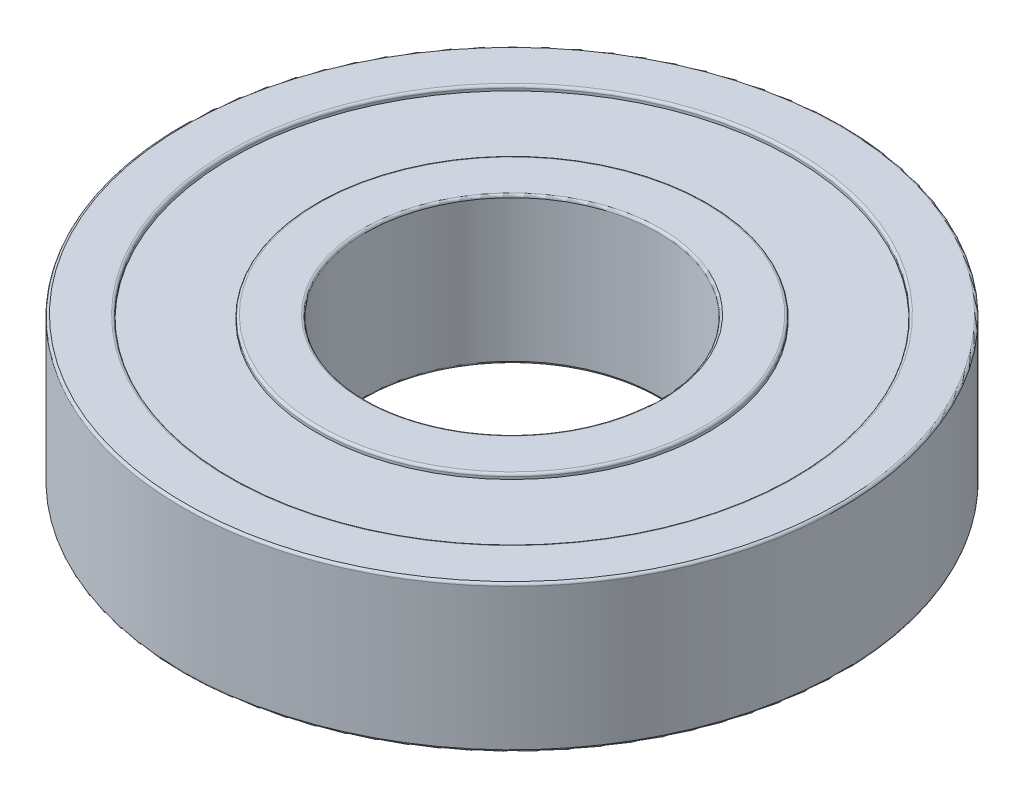
ISO-10303-21;
HEADER;
FILE_DESCRIPTION(('STEP AP214'),'2;1');
FILE_NAME('part.step','',(''),(''),'','','');
FILE_SCHEMA(('AUTOMOTIVE_DESIGN { 1 0 10303 214 1 1 1 1 }'));
ENDSEC;
DATA;
#1=APPLICATION_CONTEXT('core data for automotive mechanical design processes');
#2=APPLICATION_PROTOCOL_DEFINITION('international standard','automotive_design',2000,#1);
#3=PRODUCT_CONTEXT('',#1,'mechanical');
#4=PRODUCT('Part','Part','',(#3));
#5=PRODUCT_RELATED_PRODUCT_CATEGORY('part','',(#4));
#6=PRODUCT_DEFINITION_FORMATION('','',#4);
#7=PRODUCT_DEFINITION_CONTEXT('part definition',#1,'design');
#8=PRODUCT_DEFINITION('design','',#6,#7);
#9=PRODUCT_DEFINITION_SHAPE('','',#8);
#10=(LENGTH_UNIT() NAMED_UNIT(*) SI_UNIT(.MILLI.,.METRE.));
#11=(NAMED_UNIT(*) PLANE_ANGLE_UNIT() SI_UNIT($,.RADIAN.));
#12=(NAMED_UNIT(*) SI_UNIT($,.STERADIAN.) SOLID_ANGLE_UNIT());
#13=UNCERTAINTY_MEASURE_WITH_UNIT(LENGTH_MEASURE(1.E-05),#10,'distance_accuracy_value','');
#14=(GEOMETRIC_REPRESENTATION_CONTEXT(3) GLOBAL_UNCERTAINTY_ASSIGNED_CONTEXT((#13)) GLOBAL_UNIT_ASSIGNED_CONTEXT((#10,
#11,#12)) REPRESENTATION_CONTEXT('',''));
#15=CARTESIAN_POINT('',(0.,0.,0.));
#16=DIRECTION('',(0.,0.,1.));
#17=DIRECTION('',(1.,0.,0.));
#18=AXIS2_PLACEMENT_3D('',#15,#16,#17);
#19=CARTESIAN_POINT('',(0.,0.,0.));
#20=DIRECTION('',(0.,-1.,0.));
#21=DIRECTION('',(0.,0.,-1.));
#22=AXIS2_PLACEMENT_3D('',#19,#20,#21);
#23=CYLINDRICAL_SURFACE('',#22,5.75);
#24=CARTESIAN_POINT('',(0.,-1.45,0.));
#25=DIRECTION('',(0.,1.,0.));
#26=DIRECTION('',(0.,0.,1.));
#27=AXIS2_PLACEMENT_3D('',#24,#25,#26);
#28=CIRCLE('',#27,5.75);
#29=CARTESIAN_POINT('',(0.,-1.45,5.75));
#30=VERTEX_POINT('',#29);
#31=EDGE_CURVE('E75',#30,#30,#28,.F.);
#32=ORIENTED_EDGE('',*,*,#31,.T.);
#33=EDGE_LOOP('',(#32));
#34=FACE_BOUND('',#33,.T.);
#35=CARTESIAN_POINT('',(0.,-1.4,0.));
#36=DIRECTION('',(0.,1.,0.));
#37=DIRECTION('',(0.,0.,1.));
#38=AXIS2_PLACEMENT_3D('',#35,#36,#37);
#39=CIRCLE('',#38,5.75);
#40=CARTESIAN_POINT('',(0.,-1.4,5.75));
#41=VERTEX_POINT('',#40);
#42=EDGE_CURVE('E90',#41,#41,#39,.F.);
#43=ORIENTED_EDGE('',*,*,#42,.F.);
#44=EDGE_LOOP('',(#43));
#45=FACE_BOUND('',#44,.T.);
#46=ADVANCED_FACE('F33',(#34,#45),#23,.F.);
#47=CARTESIAN_POINT('',(0.,0.,0.));
#48=DIRECTION('',(0.,-1.,0.));
#49=DIRECTION('',(0.,0.,-1.));
#50=AXIS2_PLACEMENT_3D('',#47,#48,#49);
#51=CYLINDRICAL_SURFACE('',#50,4.);
#52=CARTESIAN_POINT('',(0.,-1.45,0.));
#53=DIRECTION('',(0.,1.,0.));
#54=DIRECTION('',(0.,0.,1.));
#55=AXIS2_PLACEMENT_3D('',#52,#53,#54);
#56=CIRCLE('',#55,4.);
#57=CARTESIAN_POINT('',(0.,-1.45,4.));
#58=VERTEX_POINT('',#57);
#59=EDGE_CURVE('E57',#58,#58,#56,.T.);
#60=ORIENTED_EDGE('',*,*,#59,.T.);
#61=EDGE_LOOP('',(#60));
#62=FACE_BOUND('',#61,.T.);
#63=CARTESIAN_POINT('',(0.,-1.4,0.));
#64=DIRECTION('',(0.,1.,0.));
#65=DIRECTION('',(0.,0.,1.));
#66=AXIS2_PLACEMENT_3D('',#63,#64,#65);
#67=CIRCLE('',#66,4.);
#68=CARTESIAN_POINT('',(0.,-1.4,4.));
#69=VERTEX_POINT('',#68);
#70=EDGE_CURVE('E96',#69,#69,#67,.T.);
#71=ORIENTED_EDGE('',*,*,#70,.F.);
#72=EDGE_LOOP('',(#71));
#73=FACE_BOUND('',#72,.T.);
#74=ADVANCED_FACE('F169',(#62,#73),#51,.T.);
#75=CARTESIAN_POINT('',(0.,0.,0.));
#76=DIRECTION('',(0.,-1.,0.));
#77=DIRECTION('',(0.,0.,-1.));
#78=AXIS2_PLACEMENT_3D('',#75,#76,#77);
#79=CYLINDRICAL_SURFACE('',#78,5.75);
#80=CARTESIAN_POINT('',(0.,1.45,0.));
#81=DIRECTION('',(0.,-1.,0.));
#82=DIRECTION('',(0.,0.,-1.));
#83=AXIS2_PLACEMENT_3D('',#80,#81,#82);
#84=CIRCLE('',#83,5.75);
#85=CARTESIAN_POINT('',(0.,1.45,-5.75));
#86=VERTEX_POINT('',#85);
#87=EDGE_CURVE('E66',#86,#86,#84,.F.);
#88=ORIENTED_EDGE('',*,*,#87,.T.);
#89=EDGE_LOOP('',(#88));
#90=FACE_BOUND('',#89,.T.);
#91=CARTESIAN_POINT('',(0.,1.4,0.));
#92=DIRECTION('',(0.,-1.,0.));
#93=DIRECTION('',(0.,0.,-1.));
#94=AXIS2_PLACEMENT_3D('',#91,#92,#93);
#95=CIRCLE('',#94,5.75);
#96=CARTESIAN_POINT('',(0.,1.4,-5.75));
#97=VERTEX_POINT('',#96);
#98=EDGE_CURVE('E109',#97,#97,#95,.F.);
#99=ORIENTED_EDGE('',*,*,#98,.F.);
#100=EDGE_LOOP('',(#99));
#101=FACE_BOUND('',#100,.T.);
#102=ADVANCED_FACE('F157',(#90,#101),#79,.F.);
#103=CARTESIAN_POINT('',(0.,0.,0.));
#104=DIRECTION('',(0.,-1.,0.));
#105=DIRECTION('',(0.,0.,-1.));
#106=AXIS2_PLACEMENT_3D('',#103,#104,#105);
#107=CYLINDRICAL_SURFACE('',#106,6.75);
#108=CARTESIAN_POINT('',(0.,-1.45,0.));
#109=DIRECTION('',(0.,1.,0.));
#110=DIRECTION('',(0.,0.,1.));
#111=AXIS2_PLACEMENT_3D('',#108,#109,#110);
#112=CIRCLE('',#111,6.75);
#113=CARTESIAN_POINT('',(0.,-1.45,6.75));
#114=VERTEX_POINT('',#113);
#115=EDGE_CURVE('E78',#114,#114,#112,.T.);
#116=ORIENTED_EDGE('',*,*,#115,.T.);
#117=EDGE_LOOP('',(#116));
#118=FACE_BOUND('',#117,.T.);
#119=CARTESIAN_POINT('',(0.,1.45,0.));
#120=DIRECTION('',(0.,-1.,0.));
#121=DIRECTION('',(0.,0.,-1.));
#122=AXIS2_PLACEMENT_3D('',#119,#120,#121);
#123=CIRCLE('',#122,6.75);
#124=CARTESIAN_POINT('',(0.,1.45,-6.75));
#125=VERTEX_POINT('',#124);
#126=EDGE_CURVE('E81',#125,#125,#123,.T.);
#127=ORIENTED_EDGE('',*,*,#126,.T.);
#128=EDGE_LOOP('',(#127));
#129=FACE_BOUND('',#128,.T.);
#130=ADVANCED_FACE('F168',(#118,#129),#107,.T.);
#131=CARTESIAN_POINT('',(-6.75,1.5,0.));
#132=DIRECTION('',(0.,-1.,0.));
#133=DIRECTION('',(0.,0.,-1.));
#134=AXIS2_PLACEMENT_3D('',#131,#132,#133);
#135=PLANE('',#134);
#136=CARTESIAN_POINT('',(0.,1.5,0.));
#137=DIRECTION('',(0.,-1.,0.));
#138=DIRECTION('',(0.,0.,-1.));
#139=AXIS2_PLACEMENT_3D('',#136,#137,#138);
#140=CIRCLE('',#139,5.8);
#141=CARTESIAN_POINT('',(0.,1.5,-5.8));
#142=VERTEX_POINT('',#141);
#143=EDGE_CURVE('E69',#142,#142,#140,.T.);
#144=ORIENTED_EDGE('',*,*,#143,.T.);
#145=EDGE_LOOP('',(#144));
#146=FACE_BOUND('',#145,.T.);
#147=CARTESIAN_POINT('',(0.,1.5,0.));
#148=DIRECTION('',(0.,-1.,0.));
#149=DIRECTION('',(0.,0.,-1.));
#150=AXIS2_PLACEMENT_3D('',#147,#148,#149);
#151=CIRCLE('',#150,6.7);
#152=CARTESIAN_POINT('',(0.,1.5,-6.7));
#153=VERTEX_POINT('',#152);
#154=EDGE_CURVE('E72',#153,#153,#151,.F.);
#155=ORIENTED_EDGE('',*,*,#154,.T.);
#156=EDGE_LOOP('',(#155));
#157=FACE_BOUND('',#156,.T.);
#158=ADVANCED_FACE('F175',(#146,#157),#135,.F.);
#159=CARTESIAN_POINT('',(-6.75,-1.5,0.));
#160=DIRECTION('',(0.,1.,0.));
#161=DIRECTION('',(0.,0.,1.));
#162=AXIS2_PLACEMENT_3D('',#159,#160,#161);
#163=PLANE('',#162);
#164=CARTESIAN_POINT('',(0.,-1.5,0.));
#165=DIRECTION('',(0.,1.,0.));
#166=DIRECTION('',(0.,0.,1.));
#167=AXIS2_PLACEMENT_3D('',#164,#165,#166);
#168=CIRCLE('',#167,6.7);
#169=CARTESIAN_POINT('',(0.,-1.5,6.7));
#170=VERTEX_POINT('',#169);
#171=EDGE_CURVE('E84',#170,#170,#168,.F.);
#172=ORIENTED_EDGE('',*,*,#171,.T.);
#173=EDGE_LOOP('',(#172));
#174=FACE_BOUND('',#173,.T.);
#175=CARTESIAN_POINT('',(0.,-1.5,0.));
#176=DIRECTION('',(0.,1.,0.));
#177=DIRECTION('',(0.,0.,1.));
#178=AXIS2_PLACEMENT_3D('',#175,#176,#177);
#179=CIRCLE('',#178,5.8);
#180=CARTESIAN_POINT('',(0.,-1.5,5.8));
#181=VERTEX_POINT('',#180);
#182=EDGE_CURVE('E87',#181,#181,#179,.T.);
#183=ORIENTED_EDGE('',*,*,#182,.T.);
#184=EDGE_LOOP('',(#183));
#185=FACE_BOUND('',#184,.T.);
#186=ADVANCED_FACE('F244',(#174,#185),#163,.F.);
#187=CARTESIAN_POINT('',(-5.75,1.4,0.));
#188=DIRECTION('',(0.,-1.,0.));
#189=DIRECTION('',(0.,0.,-1.));
#190=AXIS2_PLACEMENT_3D('',#187,#188,#189);
#191=PLANE('',#190);
#192=CARTESIAN_POINT('',(0.,1.4,0.));
#193=DIRECTION('',(0.,-1.,0.));
#194=DIRECTION('',(0.,0.,-1.));
#195=AXIS2_PLACEMENT_3D('',#192,#193,#194);
#196=CIRCLE('',#195,4.);
#197=CARTESIAN_POINT('',(0.,1.4,-4.));
#198=VERTEX_POINT('',#197);
#199=EDGE_CURVE('E103',#198,#198,#196,.F.);
#200=ORIENTED_EDGE('',*,*,#199,.F.);
#201=EDGE_LOOP('',(#200));
#202=FACE_BOUND('',#201,.T.);
#203=ORIENTED_EDGE('',*,*,#98,.T.);
#204=EDGE_LOOP('',(#203));
#205=FACE_BOUND('',#204,.T.);
#206=ADVANCED_FACE('F253',(#202,#205),#191,.F.);
#207=CARTESIAN_POINT('',(-3.,1.5,0.));
#208=DIRECTION('',(0.,-1.,0.));
#209=DIRECTION('',(0.,0.,-1.));
#210=AXIS2_PLACEMENT_3D('',#207,#208,#209);
#211=PLANE('',#210);
#212=CARTESIAN_POINT('',(0.,1.5,0.));
#213=DIRECTION('',(0.,-1.,0.));
#214=DIRECTION('',(0.,0.,-1.));
#215=AXIS2_PLACEMENT_3D('',#212,#213,#214);
#216=CIRCLE('',#215,3.05);
#217=CARTESIAN_POINT('',(0.,1.5,-3.05));
#218=VERTEX_POINT('',#217);
#219=EDGE_CURVE('E41',#218,#218,#216,.T.);
#220=ORIENTED_EDGE('',*,*,#219,.T.);
#221=EDGE_LOOP('',(#220));
#222=FACE_BOUND('',#221,.T.);
#223=CARTESIAN_POINT('',(0.,1.5,0.));
#224=DIRECTION('',(0.,-1.,0.));
#225=DIRECTION('',(0.,0.,-1.));
#226=AXIS2_PLACEMENT_3D('',#223,#224,#225);
#227=CIRCLE('',#226,3.95);
#228=CARTESIAN_POINT('',(0.,1.5,-3.95));
#229=VERTEX_POINT('',#228);
#230=EDGE_CURVE('E45',#229,#229,#227,.F.);
#231=ORIENTED_EDGE('',*,*,#230,.T.);
#232=EDGE_LOOP('',(#231));
#233=FACE_BOUND('',#232,.T.);
#234=ADVANCED_FACE('F309',(#222,#233),#211,.F.);
#235=CARTESIAN_POINT('',(0.,0.,0.));
#236=DIRECTION('',(0.,-1.,0.));
#237=DIRECTION('',(0.,0.,-1.));
#238=AXIS2_PLACEMENT_3D('',#235,#236,#237);
#239=CYLINDRICAL_SURFACE('',#238,4.);
#240=CARTESIAN_POINT('',(0.,1.45,0.));
#241=DIRECTION('',(0.,-1.,0.));
#242=DIRECTION('',(0.,0.,-1.));
#243=AXIS2_PLACEMENT_3D('',#240,#241,#242);
#244=CIRCLE('',#243,4.);
#245=CARTESIAN_POINT('',(0.,1.45,-4.));
#246=VERTEX_POINT('',#245);
#247=EDGE_CURVE('E10',#246,#246,#244,.T.);
#248=ORIENTED_EDGE('',*,*,#247,.T.);
#249=EDGE_LOOP('',(#248));
#250=FACE_BOUND('',#249,.T.);
#251=ORIENTED_EDGE('',*,*,#199,.T.);
#252=EDGE_LOOP('',(#251));
#253=FACE_BOUND('',#252,.T.);
#254=ADVANCED_FACE('F142',(#250,#253),#239,.T.);
#255=CARTESIAN_POINT('',(0.,0.,0.));
#256=DIRECTION('',(0.,-1.,0.));
#257=DIRECTION('',(0.,0.,-1.));
#258=AXIS2_PLACEMENT_3D('',#255,#256,#257);
#259=CYLINDRICAL_SURFACE('',#258,3.);
#260=CARTESIAN_POINT('',(0.,-1.45,0.));
#261=DIRECTION('',(0.,1.,0.));
#262=DIRECTION('',(0.,0.,1.));
#263=AXIS2_PLACEMENT_3D('',#260,#261,#262);
#264=CIRCLE('',#263,3.);
#265=CARTESIAN_POINT('',(0.,-1.45,3.));
#266=VERTEX_POINT('',#265);
#267=EDGE_CURVE('E49',#266,#266,#264,.F.);
#268=ORIENTED_EDGE('',*,*,#267,.T.);
#269=EDGE_LOOP('',(#268));
#270=FACE_BOUND('',#269,.T.);
#271=CARTESIAN_POINT('',(0.,1.45,0.));
#272=DIRECTION('',(0.,-1.,0.));
#273=DIRECTION('',(0.,0.,-1.));
#274=AXIS2_PLACEMENT_3D('',#271,#272,#273);
#275=CIRCLE('',#274,3.);
#276=CARTESIAN_POINT('',(0.,1.45,-3.));
#277=VERTEX_POINT('',#276);
#278=EDGE_CURVE('E54',#277,#277,#275,.F.);
#279=ORIENTED_EDGE('',*,*,#278,.T.);
#280=EDGE_LOOP('',(#279));
#281=FACE_BOUND('',#280,.T.);
#282=ADVANCED_FACE('F323',(#270,#281),#259,.F.);
#283=CARTESIAN_POINT('',(-3.,-1.5,0.));
#284=DIRECTION('',(0.,1.,0.));
#285=DIRECTION('',(0.,0.,1.));
#286=AXIS2_PLACEMENT_3D('',#283,#284,#285);
#287=PLANE('',#286);
#288=CARTESIAN_POINT('',(0.,-1.5,0.));
#289=DIRECTION('',(0.,1.,0.));
#290=DIRECTION('',(0.,0.,1.));
#291=AXIS2_PLACEMENT_3D('',#288,#289,#290);
#292=CIRCLE('',#291,3.95);
#293=CARTESIAN_POINT('',(0.,-1.5,3.95));
#294=VERTEX_POINT('',#293);
#295=EDGE_CURVE('E60',#294,#294,#292,.F.);
#296=ORIENTED_EDGE('',*,*,#295,.T.);
#297=EDGE_LOOP('',(#296));
#298=FACE_BOUND('',#297,.T.);
#299=CARTESIAN_POINT('',(0.,-1.5,0.));
#300=DIRECTION('',(0.,1.,0.));
#301=DIRECTION('',(0.,0.,1.));
#302=AXIS2_PLACEMENT_3D('',#299,#300,#301);
#303=CIRCLE('',#302,3.05);
#304=CARTESIAN_POINT('',(0.,-1.5,3.05));
#305=VERTEX_POINT('',#304);
#306=EDGE_CURVE('E63',#305,#305,#303,.T.);
#307=ORIENTED_EDGE('',*,*,#306,.T.);
#308=EDGE_LOOP('',(#307));
#309=FACE_BOUND('',#308,.T.);
#310=ADVANCED_FACE('F331',(#298,#309),#287,.F.);
#311=CARTESIAN_POINT('',(-5.75,-1.4,0.));
#312=DIRECTION('',(0.,1.,0.));
#313=DIRECTION('',(0.,0.,1.));
#314=AXIS2_PLACEMENT_3D('',#311,#312,#313);
#315=PLANE('',#314);
#316=ORIENTED_EDGE('',*,*,#70,.T.);
#317=EDGE_LOOP('',(#316));
#318=FACE_BOUND('',#317,.T.);
#319=ORIENTED_EDGE('',*,*,#42,.T.);
#320=EDGE_LOOP('',(#319));
#321=FACE_BOUND('',#320,.T.);
#322=ADVANCED_FACE('F265',(#318,#321),#315,.F.);
#323=CARTESIAN_POINT('',(0.,-1.45,0.));
#324=DIRECTION('',(0.,1.,0.));
#325=DIRECTION('',(0.,0.,1.));
#326=AXIS2_PLACEMENT_3D('',#323,#324,#325);
#327=TOROIDAL_SURFACE('',#326,6.7,0.05);
#328=ORIENTED_EDGE('',*,*,#115,.F.);
#329=EDGE_LOOP('',(#328));
#330=FACE_BOUND('',#329,.T.);
#331=ORIENTED_EDGE('',*,*,#171,.F.);
#332=EDGE_LOOP('',(#331));
#333=FACE_BOUND('',#332,.T.);
#334=ADVANCED_FACE('F259',(#330,#333),#327,.T.);
#335=CARTESIAN_POINT('',(0.,-1.45,0.));
#336=DIRECTION('',(0.,1.,0.));
#337=DIRECTION('',(0.,0.,1.));
#338=AXIS2_PLACEMENT_3D('',#335,#336,#337);
#339=TOROIDAL_SURFACE('',#338,5.8,0.05);
#340=ORIENTED_EDGE('',*,*,#182,.F.);
#341=EDGE_LOOP('',(#340));
#342=FACE_BOUND('',#341,.T.);
#343=ORIENTED_EDGE('',*,*,#31,.F.);
#344=EDGE_LOOP('',(#343));
#345=FACE_BOUND('',#344,.T.);
#346=ADVANCED_FACE('F264',(#342,#345),#339,.T.);
#347=CARTESIAN_POINT('',(0.,1.45,0.));
#348=DIRECTION('',(0.,-1.,0.));
#349=DIRECTION('',(0.,0.,-1.));
#350=AXIS2_PLACEMENT_3D('',#347,#348,#349);
#351=TOROIDAL_SURFACE('',#350,5.8,0.05);
#352=ORIENTED_EDGE('',*,*,#87,.F.);
#353=EDGE_LOOP('',(#352));
#354=FACE_BOUND('',#353,.T.);
#355=ORIENTED_EDGE('',*,*,#143,.F.);
#356=EDGE_LOOP('',(#355));
#357=FACE_BOUND('',#356,.T.);
#358=ADVANCED_FACE('F276',(#354,#357),#351,.T.);
#359=CARTESIAN_POINT('',(0.,1.45,0.));
#360=DIRECTION('',(0.,-1.,0.));
#361=DIRECTION('',(0.,0.,-1.));
#362=AXIS2_PLACEMENT_3D('',#359,#360,#361);
#363=TOROIDAL_SURFACE('',#362,6.7,0.05);
#364=ORIENTED_EDGE('',*,*,#154,.F.);
#365=EDGE_LOOP('',(#364));
#366=FACE_BOUND('',#365,.T.);
#367=ORIENTED_EDGE('',*,*,#126,.F.);
#368=EDGE_LOOP('',(#367));
#369=FACE_BOUND('',#368,.T.);
#370=ADVANCED_FACE('F286',(#366,#369),#363,.T.);
#371=CARTESIAN_POINT('',(0.,-1.45,0.));
#372=DIRECTION('',(0.,1.,0.));
#373=DIRECTION('',(0.,0.,1.));
#374=AXIS2_PLACEMENT_3D('',#371,#372,#373);
#375=TOROIDAL_SURFACE('',#374,3.95,0.05);
#376=ORIENTED_EDGE('',*,*,#59,.F.);
#377=EDGE_LOOP('',(#376));
#378=FACE_BOUND('',#377,.T.);
#379=ORIENTED_EDGE('',*,*,#295,.F.);
#380=EDGE_LOOP('',(#379));
#381=FACE_BOUND('',#380,.T.);
#382=ADVANCED_FACE('F296',(#378,#381),#375,.T.);
#383=CARTESIAN_POINT('',(0.,-1.45,0.));
#384=DIRECTION('',(0.,1.,0.));
#385=DIRECTION('',(0.,0.,1.));
#386=AXIS2_PLACEMENT_3D('',#383,#384,#385);
#387=TOROIDAL_SURFACE('',#386,3.05,0.05);
#388=ORIENTED_EDGE('',*,*,#306,.F.);
#389=EDGE_LOOP('',(#388));
#390=FACE_BOUND('',#389,.T.);
#391=ORIENTED_EDGE('',*,*,#267,.F.);
#392=EDGE_LOOP('',(#391));
#393=FACE_BOUND('',#392,.T.);
#394=ADVANCED_FACE('F348',(#390,#393),#387,.T.);
#395=CARTESIAN_POINT('',(0.,1.45,0.));
#396=DIRECTION('',(0.,-1.,0.));
#397=DIRECTION('',(0.,0.,-1.));
#398=AXIS2_PLACEMENT_3D('',#395,#396,#397);
#399=TOROIDAL_SURFACE('',#398,3.05,0.05);
#400=ORIENTED_EDGE('',*,*,#278,.F.);
#401=EDGE_LOOP('',(#400));
#402=FACE_BOUND('',#401,.T.);
#403=ORIENTED_EDGE('',*,*,#219,.F.);
#404=EDGE_LOOP('',(#403));
#405=FACE_BOUND('',#404,.T.);
#406=ADVANCED_FACE('F358',(#402,#405),#399,.T.);
#407=CARTESIAN_POINT('',(0.,1.45,0.));
#408=DIRECTION('',(0.,-1.,0.));
#409=DIRECTION('',(0.,0.,-1.));
#410=AXIS2_PLACEMENT_3D('',#407,#408,#409);
#411=TOROIDAL_SURFACE('',#410,3.95,0.05);
#412=ORIENTED_EDGE('',*,*,#230,.F.);
#413=EDGE_LOOP('',(#412));
#414=FACE_BOUND('',#413,.T.);
#415=ORIENTED_EDGE('',*,*,#247,.F.);
#416=EDGE_LOOP('',(#415));
#417=FACE_BOUND('',#416,.T.);
#418=ADVANCED_FACE('F35',(#414,#417),#411,.T.);
#419=CLOSED_SHELL('',(#46,#74,#102,#130,#158,#186,#206,#234,#254,#282,#310,#322,#334,#346,#358,
#370,#382,#394,#406,#418));
#420=CARTESIAN_POINT('',(-3.,-1.3,0.));
#421=DIRECTION('',(0.,-1.,0.));
#422=DIRECTION('',(0.,0.,-1.));
#423=AXIS2_PLACEMENT_3D('',#420,#421,#422);
#424=PLANE('',#423);
#425=CARTESIAN_POINT('',(0.,-1.3,0.));
#426=DIRECTION('',(0.,-1.,0.));
#427=DIRECTION('',(0.,0.,-1.));
#428=AXIS2_PLACEMENT_3D('',#425,#426,#427);
#429=CIRCLE('',#428,4.);
#430=CARTESIAN_POINT('',(0.,-1.3,-4.));
#431=VERTEX_POINT('',#430);
#432=EDGE_CURVE('E99',#431,#431,#429,.T.);
#433=ORIENTED_EDGE('',*,*,#432,.T.);
#434=EDGE_LOOP('',(#433));
#435=FACE_BOUND('',#434,.T.);
#436=CARTESIAN_POINT('',(0.,-1.3,0.));
#437=DIRECTION('',(0.,-1.,0.));
#438=DIRECTION('',(0.,0.,-1.));
#439=AXIS2_PLACEMENT_3D('',#436,#437,#438);
#440=CIRCLE('',#439,5.75);
#441=CARTESIAN_POINT('',(0.,-1.3,-5.75));
#442=VERTEX_POINT('',#441);
#443=EDGE_CURVE('E93',#442,#442,#440,.F.);
#444=ORIENTED_EDGE('',*,*,#443,.T.);
#445=EDGE_LOOP('',(#444));
#446=FACE_BOUND('',#445,.T.);
#447=ADVANCED_FACE('F154',(#435,#446),#424,.F.);
#448=CARTESIAN_POINT('',(0.,0.849999999999998,0.));
#449=DIRECTION('',(0.,-1.,0.));
#450=DIRECTION('',(0.,0.,-1.));
#451=AXIS2_PLACEMENT_3D('',#448,#449,#450);
#452=CIRCLE('',#451,5.75);
#453=CARTESIAN_POINT('',(0.,0.849999999999998,-5.75));
#454=VERTEX_POINT('',#453);
#455=EDGE_CURVE('E112',#454,#454,#452,.T.);
#456=ORIENTED_EDGE('',*,*,#455,.T.);
#457=EDGE_LOOP('',(#456));
#458=FACE_BOUND('',#457,.T.);
#459=CARTESIAN_POINT('',(0.,1.3,0.));
#460=DIRECTION('',(0.,1.,0.));
#461=DIRECTION('',(0.,0.,1.));
#462=AXIS2_PLACEMENT_3D('',#459,#460,#461);
#463=CIRCLE('',#462,5.75);
#464=CARTESIAN_POINT('',(0.,1.3,5.75));
#465=VERTEX_POINT('',#464);
#466=EDGE_CURVE('E106',#465,#465,#463,.F.);
#467=ORIENTED_EDGE('',*,*,#466,.F.);
#468=EDGE_LOOP('',(#467));
#469=FACE_BOUND('',#468,.T.);
#470=ADVANCED_FACE('F151',(#458,#469),#79,.F.);
#471=CARTESIAN_POINT('',(0.,0.,0.));
#472=DIRECTION('',(0.,-1.,0.));
#473=DIRECTION('',(0.,0.,-1.));
#474=AXIS2_PLACEMENT_3D('',#471,#472,#473);
#475=TOROIDAL_SURFACE('',#474,4.51407929056917,1.5);
#476=ORIENTED_EDGE('',*,*,#455,.F.);
#477=EDGE_LOOP('',(#476));
#478=FACE_BOUND('',#477,.T.);
#479=CARTESIAN_POINT('',(0.,-0.850000000000002,0.));
#480=DIRECTION('',(0.,-1.,0.));
#481=DIRECTION('',(0.,0.,-1.));
#482=AXIS2_PLACEMENT_3D('',#479,#480,#481);
#483=CIRCLE('',#482,5.75);
#484=CARTESIAN_POINT('',(0.,-0.850000000000002,-5.75));
#485=VERTEX_POINT('',#484);
#486=EDGE_CURVE('E115',#485,#485,#483,.T.);
#487=ORIENTED_EDGE('',*,*,#486,.T.);
#488=EDGE_LOOP('',(#487));
#489=FACE_BOUND('',#488,.T.);
#490=ADVANCED_FACE('F153',(#478,#489),#475,.F.);
#491=ORIENTED_EDGE('',*,*,#486,.F.);
#492=EDGE_LOOP('',(#491));
#493=FACE_BOUND('',#492,.T.);
#494=ORIENTED_EDGE('',*,*,#443,.F.);
#495=EDGE_LOOP('',(#494));
#496=FACE_BOUND('',#495,.T.);
#497=ADVANCED_FACE('F147',(#493,#496),#23,.F.);
#498=CARTESIAN_POINT('',(-3.,1.3,0.));
#499=DIRECTION('',(0.,1.,0.));
#500=DIRECTION('',(0.,0.,1.));
#501=AXIS2_PLACEMENT_3D('',#498,#499,#500);
#502=PLANE('',#501);
#503=CARTESIAN_POINT('',(0.,1.3,0.));
#504=DIRECTION('',(0.,1.,0.));
#505=DIRECTION('',(0.,0.,1.));
#506=AXIS2_PLACEMENT_3D('',#503,#504,#505);
#507=CIRCLE('',#506,4.);
#508=CARTESIAN_POINT('',(0.,1.3,4.));
#509=VERTEX_POINT('',#508);
#510=EDGE_CURVE('E102',#509,#509,#507,.F.);
#511=ORIENTED_EDGE('',*,*,#510,.F.);
#512=EDGE_LOOP('',(#511));
#513=FACE_BOUND('',#512,.T.);
#514=ORIENTED_EDGE('',*,*,#466,.T.);
#515=EDGE_LOOP('',(#514));
#516=FACE_BOUND('',#515,.T.);
#517=ADVANCED_FACE('F140',(#513,#516),#502,.F.);
#518=CARTESIAN_POINT('',(0.,0.849999999999998,0.));
#519=DIRECTION('',(0.,-1.,0.));
#520=DIRECTION('',(0.,0.,-1.));
#521=AXIS2_PLACEMENT_3D('',#518,#519,#520);
#522=CIRCLE('',#521,4.);
#523=CARTESIAN_POINT('',(0.,0.849999999999998,-4.));
#524=VERTEX_POINT('',#523);
#525=EDGE_CURVE('E118',#524,#524,#522,.T.);
#526=ORIENTED_EDGE('',*,*,#525,.F.);
#527=EDGE_LOOP('',(#526));
#528=FACE_BOUND('',#527,.T.);
#529=ORIENTED_EDGE('',*,*,#510,.T.);
#530=EDGE_LOOP('',(#529));
#531=FACE_BOUND('',#530,.T.);
#532=ADVANCED_FACE('F133',(#528,#531),#239,.T.);
#533=CARTESIAN_POINT('',(0.,0.,0.));
#534=DIRECTION('',(0.,-1.,0.));
#535=DIRECTION('',(0.,0.,-1.));
#536=AXIS2_PLACEMENT_3D('',#533,#534,#535);
#537=TOROIDAL_SURFACE('',#536,5.23592070943083,1.5);
#538=CARTESIAN_POINT('',(0.,-0.850000000000002,0.));
#539=DIRECTION('',(0.,-1.,0.));
#540=DIRECTION('',(0.,0.,-1.));
#541=AXIS2_PLACEMENT_3D('',#538,#539,#540);
#542=CIRCLE('',#541,4.);
#543=CARTESIAN_POINT('',(0.,-0.850000000000002,-4.));
#544=VERTEX_POINT('',#543);
#545=EDGE_CURVE('E123',#544,#544,#542,.T.);
#546=ORIENTED_EDGE('',*,*,#545,.F.);
#547=EDGE_LOOP('',(#546));
#548=FACE_BOUND('',#547,.T.);
#549=ORIENTED_EDGE('',*,*,#525,.T.);
#550=EDGE_LOOP('',(#549));
#551=FACE_BOUND('',#550,.T.);
#552=ADVANCED_FACE('F130',(#548,#551),#537,.F.);
#553=ORIENTED_EDGE('',*,*,#545,.T.);
#554=EDGE_LOOP('',(#553));
#555=FACE_BOUND('',#554,.T.);
#556=ORIENTED_EDGE('',*,*,#432,.F.);
#557=EDGE_LOOP('',(#556));
#558=FACE_BOUND('',#557,.T.);
#559=ADVANCED_FACE('F127',(#555,#558),#51,.T.);
#560=CLOSED_SHELL('',(#447,#470,#490,#497,#517,#532,#552,#559));
#561=ORIENTED_CLOSED_SHELL('',*,#560,.T.);
#562=BREP_WITH_VOIDS('B2',#419,(#561));
#563=ADVANCED_BREP_SHAPE_REPRESENTATION('',(#18,#562),#14);
#564=SHAPE_DEFINITION_REPRESENTATION(#9,#563);
ENDSEC;
END-ISO-10303-21;
